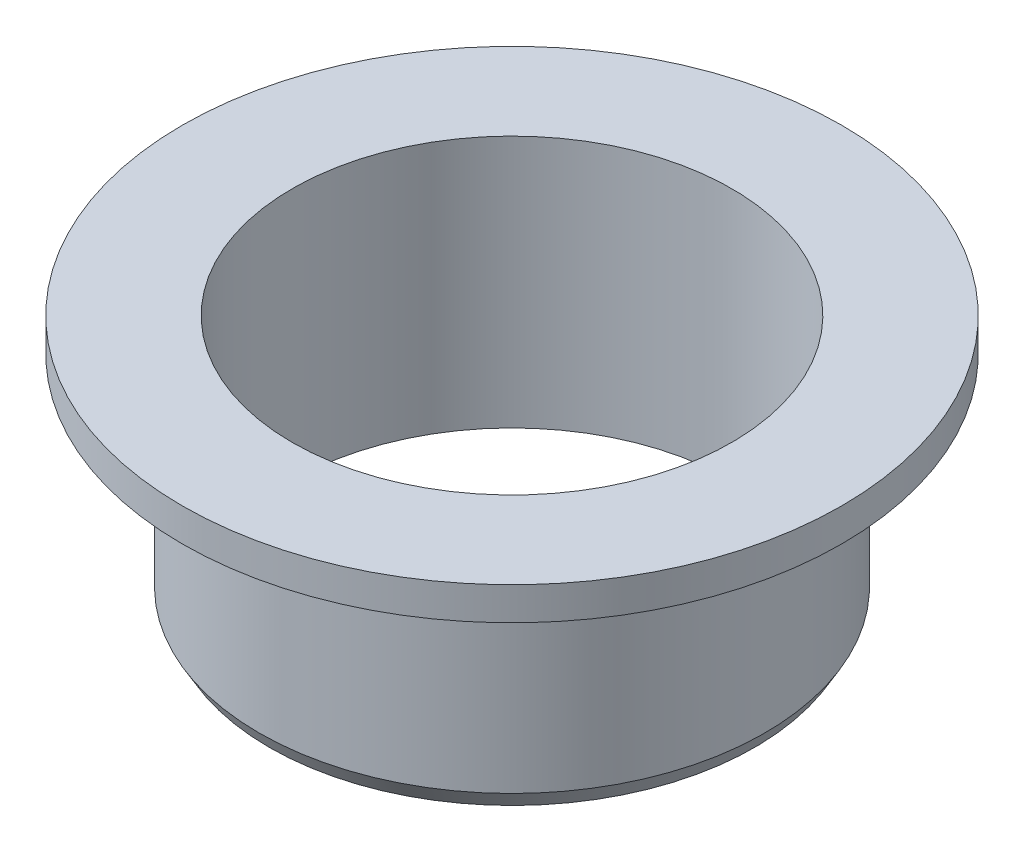
ISO-10303-21;
HEADER;
FILE_DESCRIPTION(('STEP AP214'),'2;1');
FILE_NAME('part.step','',(''),(''),'','','');
FILE_SCHEMA(('AUTOMOTIVE_DESIGN { 1 0 10303 214 1 1 1 1 }'));
ENDSEC;
DATA;
#1=APPLICATION_CONTEXT('core data for automotive mechanical design processes');
#2=APPLICATION_PROTOCOL_DEFINITION('international standard','automotive_design',2000,#1);
#3=PRODUCT_CONTEXT('',#1,'mechanical');
#4=PRODUCT('Part','Part','',(#3));
#5=PRODUCT_RELATED_PRODUCT_CATEGORY('part','',(#4));
#6=PRODUCT_DEFINITION_FORMATION('','',#4);
#7=PRODUCT_DEFINITION_CONTEXT('part definition',#1,'design');
#8=PRODUCT_DEFINITION('design','',#6,#7);
#9=PRODUCT_DEFINITION_SHAPE('','',#8);
#10=(LENGTH_UNIT() NAMED_UNIT(*) SI_UNIT(.MILLI.,.METRE.));
#11=(NAMED_UNIT(*) PLANE_ANGLE_UNIT() SI_UNIT($,.RADIAN.));
#12=(NAMED_UNIT(*) SI_UNIT($,.STERADIAN.) SOLID_ANGLE_UNIT());
#13=UNCERTAINTY_MEASURE_WITH_UNIT(LENGTH_MEASURE(1.E-05),#10,'distance_accuracy_value','');
#14=(GEOMETRIC_REPRESENTATION_CONTEXT(3) GLOBAL_UNCERTAINTY_ASSIGNED_CONTEXT((#13)) GLOBAL_UNIT_ASSIGNED_CONTEXT((#10,
#11,#12)) REPRESENTATION_CONTEXT('',''));
#15=CARTESIAN_POINT('',(0.,0.,0.));
#16=DIRECTION('',(0.,0.,1.));
#17=DIRECTION('',(1.,0.,0.));
#18=AXIS2_PLACEMENT_3D('',#15,#16,#17);
#19=CARTESIAN_POINT('',(-10.,0.,0.));
#20=DIRECTION('',(0.,1.,0.));
#21=DIRECTION('',(0.,0.,1.));
#22=AXIS2_PLACEMENT_3D('',#19,#20,#21);
#23=PLANE('',#22);
#24=CARTESIAN_POINT('',(0.,0.,0.));
#25=DIRECTION('',(0.,1.,0.));
#26=DIRECTION('',(0.,0.,1.));
#27=AXIS2_PLACEMENT_3D('',#24,#25,#26);
#28=CIRCLE('',#27,15.);
#29=CARTESIAN_POINT('',(0.,0.,15.));
#30=VERTEX_POINT('',#29);
#31=EDGE_CURVE('E76',#30,#30,#28,.T.);
#32=ORIENTED_EDGE('',*,*,#31,.T.);
#33=EDGE_LOOP('',(#32));
#34=FACE_BOUND('',#33,.T.);
#35=CARTESIAN_POINT('',(0.,0.,0.));
#36=DIRECTION('',(0.,1.,0.));
#37=DIRECTION('',(0.,0.,1.));
#38=AXIS2_PLACEMENT_3D('',#35,#36,#37);
#39=CIRCLE('',#38,10.);
#40=CARTESIAN_POINT('',(0.,0.,10.));
#41=VERTEX_POINT('',#40);
#42=EDGE_CURVE('E10',#41,#41,#39,.T.);
#43=ORIENTED_EDGE('',*,*,#42,.F.);
#44=EDGE_LOOP('',(#43));
#45=FACE_BOUND('',#44,.T.);
#46=ADVANCED_FACE('F39',(#34,#45),#23,.T.);
#47=CARTESIAN_POINT('',(0.,0.,0.));
#48=DIRECTION('',(0.,1.,0.));
#49=DIRECTION('',(0.,0.,1.));
#50=AXIS2_PLACEMENT_3D('',#47,#48,#49);
#51=CYLINDRICAL_SURFACE('',#50,10.);
#52=ORIENTED_EDGE('',*,*,#42,.T.);
#53=EDGE_LOOP('',(#52));
#54=FACE_BOUND('',#53,.T.);
#55=CARTESIAN_POINT('',(0.,-11.5,0.));
#56=DIRECTION('',(0.,1.,0.));
#57=DIRECTION('',(0.,0.,1.));
#58=AXIS2_PLACEMENT_3D('',#55,#56,#57);
#59=CIRCLE('',#58,10.);
#60=CARTESIAN_POINT('',(0.,-11.5,10.));
#61=VERTEX_POINT('',#60);
#62=EDGE_CURVE('E46',#61,#61,#59,.T.);
#63=ORIENTED_EDGE('',*,*,#62,.F.);
#64=EDGE_LOOP('',(#63));
#65=FACE_BOUND('',#64,.T.);
#66=ADVANCED_FACE('F96',(#54,#65),#51,.F.);
#67=CARTESIAN_POINT('',(-11.0381197846483,-11.5,0.));
#68=DIRECTION('',(0.,-1.,0.));
#69=DIRECTION('',(0.,0.,-1.));
#70=AXIS2_PLACEMENT_3D('',#67,#68,#69);
#71=PLANE('',#70);
#72=ORIENTED_EDGE('',*,*,#62,.T.);
#73=EDGE_LOOP('',(#72));
#74=FACE_BOUND('',#73,.T.);
#75=CARTESIAN_POINT('',(0.,-11.5,0.));
#76=DIRECTION('',(0.,1.,0.));
#77=DIRECTION('',(0.,0.,1.));
#78=AXIS2_PLACEMENT_3D('',#75,#76,#77);
#79=CIRCLE('',#78,11.0381197846483);
#80=CARTESIAN_POINT('',(0.,-11.5,11.0381197846483));
#81=VERTEX_POINT('',#80);
#82=EDGE_CURVE('E54',#81,#81,#79,.T.);
#83=ORIENTED_EDGE('',*,*,#82,.F.);
#84=EDGE_LOOP('',(#83));
#85=FACE_BOUND('',#84,.T.);
#86=ADVANCED_FACE('F100',(#74,#85),#71,.T.);
#87=CARTESIAN_POINT('',(0.,-10.7,0.));
#88=DIRECTION('',(0.,1.,0.));
#89=DIRECTION('',(0.,0.,1.));
#90=AXIS2_PLACEMENT_3D('',#87,#88,#89);
#91=CONICAL_SURFACE('',#90,11.5,0.523598775598301);
#92=ORIENTED_EDGE('',*,*,#82,.T.);
#93=EDGE_LOOP('',(#92));
#94=FACE_BOUND('',#93,.T.);
#95=CARTESIAN_POINT('',(0.,-10.7,0.));
#96=DIRECTION('',(0.,1.,0.));
#97=DIRECTION('',(0.,0.,1.));
#98=AXIS2_PLACEMENT_3D('',#95,#96,#97);
#99=CIRCLE('',#98,11.5);
#100=CARTESIAN_POINT('',(0.,-10.7,11.5));
#101=VERTEX_POINT('',#100);
#102=EDGE_CURVE('E61',#101,#101,#99,.T.);
#103=ORIENTED_EDGE('',*,*,#102,.F.);
#104=EDGE_LOOP('',(#103));
#105=FACE_BOUND('',#104,.T.);
#106=ADVANCED_FACE('F104',(#94,#105),#91,.T.);
#107=CARTESIAN_POINT('',(0.,0.,0.));
#108=DIRECTION('',(0.,1.,0.));
#109=DIRECTION('',(0.,0.,1.));
#110=AXIS2_PLACEMENT_3D('',#107,#108,#109);
#111=CYLINDRICAL_SURFACE('',#110,11.5);
#112=ORIENTED_EDGE('',*,*,#102,.T.);
#113=EDGE_LOOP('',(#112));
#114=FACE_BOUND('',#113,.T.);
#115=CARTESIAN_POINT('',(0.,-2.,0.));
#116=DIRECTION('',(0.,1.,0.));
#117=DIRECTION('',(0.,0.,1.));
#118=AXIS2_PLACEMENT_3D('',#115,#116,#117);
#119=CIRCLE('',#118,11.5);
#120=CARTESIAN_POINT('',(0.,-2.,11.5));
#121=VERTEX_POINT('',#120);
#122=EDGE_CURVE('E66',#121,#121,#119,.T.);
#123=ORIENTED_EDGE('',*,*,#122,.F.);
#124=EDGE_LOOP('',(#123));
#125=FACE_BOUND('',#124,.T.);
#126=ADVANCED_FACE('F110',(#114,#125),#111,.T.);
#127=CARTESIAN_POINT('',(0.,-2.,0.));
#128=DIRECTION('',(0.,1.,0.));
#129=DIRECTION('',(0.,0.,1.));
#130=AXIS2_PLACEMENT_3D('',#127,#128,#129);
#131=TOROIDAL_SURFACE('',#130,12.,0.499999999999999);
#132=ORIENTED_EDGE('',*,*,#122,.T.);
#133=EDGE_LOOP('',(#132));
#134=FACE_BOUND('',#133,.T.);
#135=CARTESIAN_POINT('',(0.,-1.5,0.));
#136=DIRECTION('',(0.,1.,0.));
#137=DIRECTION('',(0.,0.,1.));
#138=AXIS2_PLACEMENT_3D('',#135,#136,#137);
#139=CIRCLE('',#138,12.);
#140=CARTESIAN_POINT('',(0.,-1.5,12.));
#141=VERTEX_POINT('',#140);
#142=EDGE_CURVE('E70',#141,#141,#139,.T.);
#143=ORIENTED_EDGE('',*,*,#142,.F.);
#144=EDGE_LOOP('',(#143));
#145=FACE_BOUND('',#144,.T.);
#146=ADVANCED_FACE('F92',(#134,#145),#131,.F.);
#147=CARTESIAN_POINT('',(-15.,-1.5,0.));
#148=DIRECTION('',(0.,-1.,0.));
#149=DIRECTION('',(0.,0.,-1.));
#150=AXIS2_PLACEMENT_3D('',#147,#148,#149);
#151=PLANE('',#150);
#152=ORIENTED_EDGE('',*,*,#142,.T.);
#153=EDGE_LOOP('',(#152));
#154=FACE_BOUND('',#153,.T.);
#155=CARTESIAN_POINT('',(0.,-1.5,0.));
#156=DIRECTION('',(0.,1.,0.));
#157=DIRECTION('',(0.,0.,1.));
#158=AXIS2_PLACEMENT_3D('',#155,#156,#157);
#159=CIRCLE('',#158,15.);
#160=CARTESIAN_POINT('',(0.,-1.5,15.));
#161=VERTEX_POINT('',#160);
#162=EDGE_CURVE('E73',#161,#161,#159,.T.);
#163=ORIENTED_EDGE('',*,*,#162,.F.);
#164=EDGE_LOOP('',(#163));
#165=FACE_BOUND('',#164,.T.);
#166=ADVANCED_FACE('F86',(#154,#165),#151,.T.);
#167=CARTESIAN_POINT('',(0.,0.,0.));
#168=DIRECTION('',(0.,1.,0.));
#169=DIRECTION('',(0.,0.,1.));
#170=AXIS2_PLACEMENT_3D('',#167,#168,#169);
#171=CYLINDRICAL_SURFACE('',#170,15.);
#172=ORIENTED_EDGE('',*,*,#162,.T.);
#173=EDGE_LOOP('',(#172));
#174=FACE_BOUND('',#173,.T.);
#175=ORIENTED_EDGE('',*,*,#31,.F.);
#176=EDGE_LOOP('',(#175));
#177=FACE_BOUND('',#176,.T.);
#178=ADVANCED_FACE('F84',(#174,#177),#171,.T.);
#179=CLOSED_SHELL('',(#46,#66,#86,#106,#126,#146,#166,#178));
#180=MANIFOLD_SOLID_BREP('B2',#179);
#181=ADVANCED_BREP_SHAPE_REPRESENTATION('',(#18,#180),#14);
#182=SHAPE_DEFINITION_REPRESENTATION(#9,#181);
ENDSEC;
END-ISO-10303-21;
